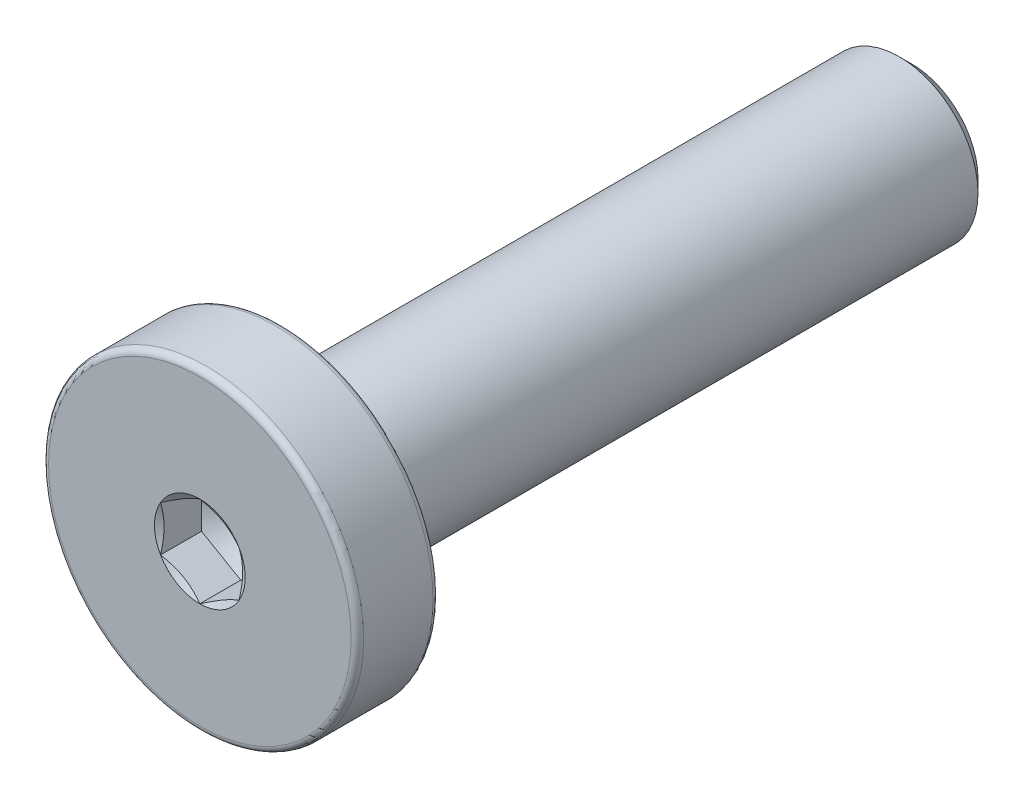
ISO-10303-21;
HEADER;
FILE_DESCRIPTION(('STEP AP214'),'2;1');
FILE_NAME('part.step','',(''),(''),'','','');
FILE_SCHEMA(('AUTOMOTIVE_DESIGN { 1 0 10303 214 1 1 1 1 }'));
ENDSEC;
DATA;
#1=APPLICATION_CONTEXT('core data for automotive mechanical design processes');
#2=APPLICATION_PROTOCOL_DEFINITION('international standard','automotive_design',2000,#1);
#3=PRODUCT_CONTEXT('',#1,'mechanical');
#4=PRODUCT('Part','Part','',(#3));
#5=PRODUCT_RELATED_PRODUCT_CATEGORY('part','',(#4));
#6=PRODUCT_DEFINITION_FORMATION('','',#4);
#7=PRODUCT_DEFINITION_CONTEXT('part definition',#1,'design');
#8=PRODUCT_DEFINITION('design','',#6,#7);
#9=PRODUCT_DEFINITION_SHAPE('','',#8);
#10=(LENGTH_UNIT() NAMED_UNIT(*) SI_UNIT(.MILLI.,.METRE.));
#11=(NAMED_UNIT(*) PLANE_ANGLE_UNIT() SI_UNIT($,.RADIAN.));
#12=(NAMED_UNIT(*) SI_UNIT($,.STERADIAN.) SOLID_ANGLE_UNIT());
#13=UNCERTAINTY_MEASURE_WITH_UNIT(LENGTH_MEASURE(1.E-05),#10,'distance_accuracy_value','');
#14=(GEOMETRIC_REPRESENTATION_CONTEXT(3) GLOBAL_UNCERTAINTY_ASSIGNED_CONTEXT((#13)) GLOBAL_UNIT_ASSIGNED_CONTEXT((#10,
#11,#12)) REPRESENTATION_CONTEXT('',''));
#15=CARTESIAN_POINT('',(0.,0.,0.));
#16=DIRECTION('',(0.,0.,1.));
#17=DIRECTION('',(1.,0.,0.));
#18=AXIS2_PLACEMENT_3D('',#15,#16,#17);
#19=CARTESIAN_POINT('',(0.,0.,1.3));
#20=DIRECTION('',(0.,0.,-1.));
#21=DIRECTION('',(-1.,0.,0.));
#22=AXIS2_PLACEMENT_3D('',#19,#20,#21);
#23=PLANE('',#22);
#24=CARTESIAN_POINT('',(0.,0.,1.3));
#25=DIRECTION('',(0.,0.,-1.));
#26=DIRECTION('',(-1.,0.,0.));
#27=AXIS2_PLACEMENT_3D('',#24,#25,#26);
#28=CIRCLE('',#27,2.4);
#29=CARTESIAN_POINT('',(-2.4,0.,1.3));
#30=VERTEX_POINT('',#29);
#31=EDGE_CURVE('E221',#30,#30,#28,.F.);
#32=ORIENTED_EDGE('',*,*,#31,.T.);
#33=EDGE_LOOP('',(#32));
#34=FACE_BOUND('',#33,.T.);
#35=CARTESIAN_POINT('',(0.,0.,1.3));
#36=DIRECTION('',(0.,0.,1.));
#37=DIRECTION('',(1.,0.,0.));
#38=AXIS2_PLACEMENT_3D('',#35,#36,#37);
#39=CIRCLE('',#38,0.72);
#40=CARTESIAN_POINT('',(-0.623538290724796,-0.36,1.3));
#41=VERTEX_POINT('',#40);
#42=CARTESIAN_POINT('',(0.,-0.72,1.3));
#43=VERTEX_POINT('',#42);
#44=EDGE_CURVE('E133',#41,#43,#39,.T.);
#45=ORIENTED_EDGE('',*,*,#44,.F.);
#46=CARTESIAN_POINT('',(-0.623538290724796,0.36,1.3));
#47=VERTEX_POINT('',#46);
#48=EDGE_CURVE('E132',#47,#41,#39,.T.);
#49=ORIENTED_EDGE('',*,*,#48,.F.);
#50=CARTESIAN_POINT('',(0.,0.72,1.3));
#51=VERTEX_POINT('',#50);
#52=EDGE_CURVE('E103',#51,#47,#39,.T.);
#53=ORIENTED_EDGE('',*,*,#52,.F.);
#54=CARTESIAN_POINT('',(0.623538290724796,0.36,1.3));
#55=VERTEX_POINT('',#54);
#56=EDGE_CURVE('E95',#55,#51,#39,.T.);
#57=ORIENTED_EDGE('',*,*,#56,.F.);
#58=CARTESIAN_POINT('',(0.623538290724796,-0.36,1.3));
#59=VERTEX_POINT('',#58);
#60=EDGE_CURVE('E53',#59,#55,#39,.T.);
#61=ORIENTED_EDGE('',*,*,#60,.F.);
#62=EDGE_CURVE('E60',#43,#59,#39,.T.);
#63=ORIENTED_EDGE('',*,*,#62,.F.);
#64=EDGE_LOOP('',(#45,#49,#53,#57,#61,#63));
#65=FACE_BOUND('',#64,.T.);
#66=ADVANCED_FACE('F34',(#34,#65),#23,.F.);
#67=CARTESIAN_POINT('',(0.,0.,1.3));
#68=DIRECTION('',(0.,0.,1.));
#69=DIRECTION('',(1.,0.,0.));
#70=AXIS2_PLACEMENT_3D('',#67,#68,#69);
#71=CYLINDRICAL_SURFACE('',#70,2.5);
#72=CARTESIAN_POINT('',(0.,0.,0.0999999999999996));
#73=DIRECTION('',(0.,0.,1.));
#74=DIRECTION('',(1.,0.,0.));
#75=AXIS2_PLACEMENT_3D('',#72,#73,#74);
#76=CIRCLE('',#75,2.5);
#77=CARTESIAN_POINT('',(2.5,0.,0.0999999999999996));
#78=VERTEX_POINT('',#77);
#79=EDGE_CURVE('E228',#78,#78,#76,.T.);
#80=ORIENTED_EDGE('',*,*,#79,.T.);
#81=EDGE_LOOP('',(#80));
#82=FACE_BOUND('',#81,.T.);
#83=CARTESIAN_POINT('',(0.,0.,1.2));
#84=DIRECTION('',(0.,0.,-1.));
#85=DIRECTION('',(-1.,0.,0.));
#86=AXIS2_PLACEMENT_3D('',#83,#84,#85);
#87=CIRCLE('',#86,2.5);
#88=CARTESIAN_POINT('',(-2.5,0.,1.2));
#89=VERTEX_POINT('',#88);
#90=EDGE_CURVE('E219',#89,#89,#87,.T.);
#91=ORIENTED_EDGE('',*,*,#90,.T.);
#92=EDGE_LOOP('',(#91));
#93=FACE_BOUND('',#92,.T.);
#94=ADVANCED_FACE('F193',(#82,#93),#71,.T.);
#95=CARTESIAN_POINT('',(0.,2.5,0.));
#96=DIRECTION('',(0.,0.,1.));
#97=DIRECTION('',(1.,0.,0.));
#98=AXIS2_PLACEMENT_3D('',#95,#96,#97);
#99=PLANE('',#98);
#100=CARTESIAN_POINT('',(0.,0.,0.));
#101=DIRECTION('',(0.,0.,1.));
#102=DIRECTION('',(1.,0.,0.));
#103=AXIS2_PLACEMENT_3D('',#100,#101,#102);
#104=CIRCLE('',#103,2.4);
#105=CARTESIAN_POINT('',(2.4,0.,0.));
#106=VERTEX_POINT('',#105);
#107=EDGE_CURVE('E223',#106,#106,#104,.F.);
#108=ORIENTED_EDGE('',*,*,#107,.T.);
#109=EDGE_LOOP('',(#108));
#110=FACE_BOUND('',#109,.T.);
#111=CARTESIAN_POINT('',(0.,0.,0.));
#112=DIRECTION('',(0.,0.,1.));
#113=DIRECTION('',(1.,0.,0.));
#114=AXIS2_PLACEMENT_3D('',#111,#112,#113);
#115=CIRCLE('',#114,1.25);
#116=CARTESIAN_POINT('',(1.25,0.,0.));
#117=VERTEX_POINT('',#116);
#118=EDGE_CURVE('E243',#117,#117,#115,.T.);
#119=ORIENTED_EDGE('',*,*,#118,.T.);
#120=EDGE_LOOP('',(#119));
#121=FACE_BOUND('',#120,.T.);
#122=ADVANCED_FACE('F199',(#110,#121),#99,.F.);
#123=CARTESIAN_POINT('',(0.,0.,1.3));
#124=DIRECTION('',(0.,0.,1.));
#125=DIRECTION('',(1.,0.,0.));
#126=AXIS2_PLACEMENT_3D('',#123,#124,#125);
#127=CYLINDRICAL_SURFACE('',#126,1.25);
#128=CARTESIAN_POINT('',(0.,0.,-9.8));
#129=DIRECTION('',(0.,0.,1.));
#130=DIRECTION('',(1.,0.,0.));
#131=AXIS2_PLACEMENT_3D('',#128,#129,#130);
#132=CIRCLE('',#131,1.25);
#133=CARTESIAN_POINT('',(1.25,0.,-9.8));
#134=VERTEX_POINT('',#133);
#135=EDGE_CURVE('E222',#134,#134,#132,.T.);
#136=ORIENTED_EDGE('',*,*,#135,.T.);
#137=EDGE_LOOP('',(#136));
#138=FACE_BOUND('',#137,.T.);
#139=ORIENTED_EDGE('',*,*,#118,.F.);
#140=EDGE_LOOP('',(#139));
#141=FACE_BOUND('',#140,.T.);
#142=ADVANCED_FACE('F237',(#138,#141),#127,.T.);
#143=CARTESIAN_POINT('',(0.,1.25,-10.));
#144=DIRECTION('',(0.,0.,1.));
#145=DIRECTION('',(1.,0.,0.));
#146=AXIS2_PLACEMENT_3D('',#143,#144,#145);
#147=PLANE('',#146);
#148=CARTESIAN_POINT('',(0.,0.,-10.));
#149=DIRECTION('',(0.,0.,1.));
#150=DIRECTION('',(1.,0.,0.));
#151=AXIS2_PLACEMENT_3D('',#148,#149,#150);
#152=CIRCLE('',#151,1.05);
#153=CARTESIAN_POINT('',(1.05,0.,-10.));
#154=VERTEX_POINT('',#153);
#155=EDGE_CURVE('E47',#154,#154,#152,.F.);
#156=ORIENTED_EDGE('',*,*,#155,.T.);
#157=EDGE_LOOP('',(#156));
#158=FACE_BOUND('',#157,.T.);
#159=ADVANCED_FACE('F208',(#158),#147,.F.);
#160=CARTESIAN_POINT('',(0.,0.,0.0999999999999996));
#161=DIRECTION('',(0.,0.,1.));
#162=DIRECTION('',(1.,0.,0.));
#163=AXIS2_PLACEMENT_3D('',#160,#161,#162);
#164=TOROIDAL_SURFACE('',#163,2.4,0.1);
#165=ORIENTED_EDGE('',*,*,#107,.F.);
#166=EDGE_LOOP('',(#165));
#167=FACE_BOUND('',#166,.T.);
#168=ORIENTED_EDGE('',*,*,#79,.F.);
#169=EDGE_LOOP('',(#168));
#170=FACE_BOUND('',#169,.T.);
#171=ADVANCED_FACE('F205',(#167,#170),#164,.T.);
#172=CARTESIAN_POINT('',(0.,0.,1.2));
#173=DIRECTION('',(0.,0.,-1.));
#174=DIRECTION('',(-1.,0.,0.));
#175=AXIS2_PLACEMENT_3D('',#172,#173,#174);
#176=TOROIDAL_SURFACE('',#175,2.4,0.1);
#177=ORIENTED_EDGE('',*,*,#90,.F.);
#178=EDGE_LOOP('',(#177));
#179=FACE_BOUND('',#178,.T.);
#180=ORIENTED_EDGE('',*,*,#31,.F.);
#181=EDGE_LOOP('',(#180));
#182=FACE_BOUND('',#181,.T.);
#183=ADVANCED_FACE('F207',(#179,#182),#176,.T.);
#184=CARTESIAN_POINT('',(0.,0.,-9.8));
#185=DIRECTION('',(0.,0.,1.));
#186=DIRECTION('',(1.,0.,0.));
#187=AXIS2_PLACEMENT_3D('',#184,#185,#186);
#188=CONICAL_SURFACE('',#187,1.25,0.785398163397446);
#189=ORIENTED_EDGE('',*,*,#155,.F.);
#190=EDGE_LOOP('',(#189));
#191=FACE_BOUND('',#190,.T.);
#192=ORIENTED_EDGE('',*,*,#135,.F.);
#193=EDGE_LOOP('',(#192));
#194=FACE_BOUND('',#193,.T.);
#195=ADVANCED_FACE('F36',(#191,#194),#188,.T.);
#196=CARTESIAN_POINT('',(0.,0.,1.21339745962156));
#197=DIRECTION('',(0.,0.,1.));
#198=DIRECTION('',(1.,0.,0.));
#199=AXIS2_PLACEMENT_3D('',#196,#197,#198);
#200=CONICAL_SURFACE('',#199,0.57,1.04719755119659);
#201=CARTESIAN_POINT('',(-0.623738290724796,0.359884529946162,1.3000666827016));
#202=CARTESIAN_POINT('',(-0.596334183076224,0.375706298873966,1.29092498161154));
#203=CARTESIAN_POINT('',(-0.568693531334009,0.391664636597911,1.28261024715404));
#204=CARTESIAN_POINT('',(-0.512933373317775,0.42385777883864,1.2680952088981));
#205=CARTESIAN_POINT('',(-0.484812874577336,0.440093156356179,1.26190004273057));
#206=CARTESIAN_POINT('',(-0.428920461083287,0.472362656332626,1.25225419383433));
#207=CARTESIAN_POINT('',(-0.401157157448591,0.488391807159711,1.24873934968173));
#208=CARTESIAN_POINT('',(-0.345499589350676,0.520525719083482,1.24453960193827));
#209=CARTESIAN_POINT('',(-0.317605527850044,0.536630362999664,1.24385122457042));
#210=CARTESIAN_POINT('',(-0.265452978487134,0.566740651413265,1.24526616577312));
#211=CARTESIAN_POINT('',(-0.241186794877551,0.580750739052463,1.24702294779668));
#212=CARTESIAN_POINT('',(-0.192830842697051,0.608669061060795,1.25259443621591));
#213=CARTESIAN_POINT('',(-0.168741106372919,0.62257727681224,1.25640950971197));
#214=CARTESIAN_POINT('',(-0.120293921029821,0.650548272311557,1.26594997998605));
#215=CARTESIAN_POINT('',(-0.0959427227560178,0.664607443190027,1.27171659508746));
#216=CARTESIAN_POINT('',(-0.0476039961030963,0.692515820035375,1.2848053589815));
#217=CARTESIAN_POINT('',(-0.023615846060041,0.706365384920094,1.29212442253269));
#218=CARTESIAN_POINT('',(0.00019999999999998,0.720115470053838,1.3000666827016));
#219=B_SPLINE_CURVE_WITH_KNOTS('',3,(#201,#202,#203,#204,#205,#206,#207,#208,#209,#210,#211,
#212,#213,#214,#215,#216,#217,#218),.UNSPECIFIED.,.F.,.F.,(4,2,2,2,2,2,2,2,4),(0.,
0.0988516266112519,0.197941190173062,0.294577051935842,0.39109411092297,0.475239352026824,
0.559399605565862,0.645461571107035,0.731354078529662),.UNSPECIFIED.);
#220=EDGE_CURVE('E11',#47,#51,#219,.T.);
#221=ORIENTED_EDGE('',*,*,#220,.T.);
#222=ORIENTED_EDGE('',*,*,#52,.T.);
#223=EDGE_LOOP('',(#221,#222));
#224=FACE_BOUND('',#223,.T.);
#225=ADVANCED_FACE('F108',(#224),#200,.F.);
#226=CARTESIAN_POINT('',(-0.623538290724796,-0.950492420756838,1.54061968375292));
#227=CARTESIAN_POINT('',(-0.623538290724796,-0.923148387773106,1.52742187170593));
#228=CARTESIAN_POINT('',(-0.623538290724796,-0.895739561138237,1.51435898036849));
#229=CARTESIAN_POINT('',(-0.623538290724796,-0.840756393091022,1.48857401397823));
#230=CARTESIAN_POINT('',(-0.623538290724796,-0.813182023556048,1.47585199896154));
#231=CARTESIAN_POINT('',(-0.623538290724796,-0.729853886737799,1.43816719951309));
#232=CARTESIAN_POINT('',(-0.623538290724796,-0.673807865396585,1.4138386819791));
#233=CARTESIAN_POINT('',(-0.623538290724796,-0.559963033674609,1.36759316950609));
#234=CARTESIAN_POINT('',(-0.623538290724796,-0.502151470945634,1.34570717177888));
#235=CARTESIAN_POINT('',(-0.623538290724796,-0.38505976560965,1.30652670924574));
#236=CARTESIAN_POINT('',(-0.623538290724796,-0.325783647625673,1.289220923179));
#237=CARTESIAN_POINT('',(-0.623538290724796,-0.235580717587191,1.26881529273624));
#238=CARTESIAN_POINT('',(-0.623538290724796,-0.205289909225538,1.26293808564223));
#239=CARTESIAN_POINT('',(-0.623538290724796,-0.144346972260456,1.2534399552596));
#240=CARTESIAN_POINT('',(-0.623538290724796,-0.11369484252445,1.24981903904531));
#241=CARTESIAN_POINT('',(-0.623538290724796,-0.0523810271352916,1.24515303668703));
#242=CARTESIAN_POINT('',(-0.623538290724796,-0.021720583070136,1.2440920931476));
#243=CARTESIAN_POINT('',(-0.623538290724796,0.0395686086964655,1.24459725450364));
#244=CARTESIAN_POINT('',(-0.623538290724796,0.0701973624271658,1.24616269925383));
#245=CARTESIAN_POINT('',(-0.623538290724796,0.144569177597164,1.25301299302503));
#246=CARTESIAN_POINT('',(-0.623538290724796,0.188190488736798,1.25962488285429));
#247=CARTESIAN_POINT('',(-0.623538290724796,0.274613833285284,1.27697245837768));
#248=CARTESIAN_POINT('',(-0.623538290724796,0.317414828320168,1.28771304941856));
#249=CARTESIAN_POINT('',(-0.623538290724796,0.403152432871886,1.31245058367352));
#250=CARTESIAN_POINT('',(-0.623538290724796,0.44606785593737,1.32651918881287));
#251=CARTESIAN_POINT('',(-0.623538290724796,0.509725385364103,1.34918952587781));
#252=CARTESIAN_POINT('',(-0.623538290724796,0.530763905493329,1.356982117505));
#253=CARTESIAN_POINT('',(-0.623538290724796,0.572678497049816,1.37301880372217));
#254=CARTESIAN_POINT('',(-0.623538290724796,0.59355449741943,1.38126308438853));
#255=CARTESIAN_POINT('',(-0.623538290724796,0.614356560025995,1.38969016402321));
#256=B_SPLINE_CURVE_WITH_KNOTS('',3,(#226,#227,#228,#229,#230,#231,#232,#233,#234,#235,#236,
#237,#238,#239,#240,#241,#242,#243,#244,#245,#246,#247,#248,#249,#250,#251,#252,#253,#254,#255),
.UNSPECIFIED.,.F.,.F.,(4,2,2,2,2,2,2,2,2,2,2,2,2,2,4),(0.,0.0910858749532263,0.182187688145635,
0.365435618950376,0.550793815170379,0.735689475406527,0.828187388463122,0.920685591534937,
1.01260933953622,1.10450998587462,1.23659516172562,1.36883775663413,1.5042395149033,
1.57154208016627,1.63887258275582),.UNSPECIFIED.);
#257=EDGE_CURVE('E102',#41,#47,#256,.T.);
#258=ORIENTED_EDGE('',*,*,#257,.T.);
#259=ORIENTED_EDGE('',*,*,#48,.T.);
#260=EDGE_LOOP('',(#258,#259));
#261=FACE_BOUND('',#260,.T.);
#262=ADVANCED_FACE('F378',(#261),#200,.F.);
#263=CARTESIAN_POINT('',(0.000200000000000004,-0.720115470053838,1.3000666827016));
#264=CARTESIAN_POINT('',(-0.0272041076485716,-0.704293701126034,1.29092498161154));
#265=CARTESIAN_POINT('',(-0.0548447593907865,-0.688335363402089,1.28261024715404));
#266=CARTESIAN_POINT('',(-0.11060491740702,-0.65614222116136,1.2680952088981));
#267=CARTESIAN_POINT('',(-0.13872541614746,-0.639906843643821,1.26190004273057));
#268=CARTESIAN_POINT('',(-0.194617829641508,-0.607637343667374,1.25225419383433));
#269=CARTESIAN_POINT('',(-0.222381133276205,-0.591608192840289,1.24873934968173));
#270=CARTESIAN_POINT('',(-0.27803870137412,-0.559474280916518,1.24453960193827));
#271=CARTESIAN_POINT('',(-0.305932762874752,-0.543369637000336,1.24385122457042));
#272=CARTESIAN_POINT('',(-0.358085312237661,-0.513259348586735,1.24526616577312));
#273=CARTESIAN_POINT('',(-0.382351495847245,-0.499249260947537,1.24702294779668));
#274=CARTESIAN_POINT('',(-0.430707448027745,-0.471330938939204,1.25259443621591));
#275=CARTESIAN_POINT('',(-0.454797184351877,-0.45742272318776,1.25640950971197));
#276=CARTESIAN_POINT('',(-0.503244369694975,-0.429451727688443,1.26594997998605));
#277=CARTESIAN_POINT('',(-0.527595567968778,-0.415392556809973,1.27171659508746));
#278=CARTESIAN_POINT('',(-0.575934294621699,-0.387484179964625,1.2848053589815));
#279=CARTESIAN_POINT('',(-0.599922444664755,-0.373634615079905,1.29212442253269));
#280=CARTESIAN_POINT('',(-0.623738290724796,-0.359884529946162,1.3000666827016));
#281=B_SPLINE_CURVE_WITH_KNOTS('',3,(#263,#264,#265,#266,#267,#268,#269,#270,#271,#272,#273,
#274,#275,#276,#277,#278,#279,#280),.UNSPECIFIED.,.F.,.F.,(4,2,2,2,2,2,2,2,4),(0.,
0.0988516266112519,0.197941190173062,0.294577051935842,0.39109411092297,0.475239352026824,
0.559399605565862,0.645461571107035,0.731354078529662),.UNSPECIFIED.);
#282=EDGE_CURVE('E140',#43,#41,#281,.T.);
#283=ORIENTED_EDGE('',*,*,#282,.T.);
#284=ORIENTED_EDGE('',*,*,#44,.T.);
#285=EDGE_LOOP('',(#283,#284));
#286=FACE_BOUND('',#285,.T.);
#287=ADVANCED_FACE('F370',(#286),#200,.F.);
#288=CARTESIAN_POINT('',(0.623738290724796,-0.359884529946162,1.3000666827016));
#289=CARTESIAN_POINT('',(0.596334183076224,-0.375706298873966,1.29092498161154));
#290=CARTESIAN_POINT('',(0.568693531334009,-0.391664636597911,1.28261024715404));
#291=CARTESIAN_POINT('',(0.512933373317775,-0.42385777883864,1.2680952088981));
#292=CARTESIAN_POINT('',(0.484812874577336,-0.440093156356179,1.26190004273057));
#293=CARTESIAN_POINT('',(0.428920461083287,-0.472362656332626,1.25225419383433));
#294=CARTESIAN_POINT('',(0.401157157448591,-0.488391807159711,1.24873934968173));
#295=CARTESIAN_POINT('',(0.345499589350676,-0.520525719083482,1.24453960193827));
#296=CARTESIAN_POINT('',(0.317605527850044,-0.536630362999664,1.24385122457042));
#297=CARTESIAN_POINT('',(0.265452978487134,-0.566740651413265,1.24526616577312));
#298=CARTESIAN_POINT('',(0.241186794877551,-0.580750739052463,1.24702294779668));
#299=CARTESIAN_POINT('',(0.192830842697051,-0.608669061060795,1.25259443621591));
#300=CARTESIAN_POINT('',(0.168741106372919,-0.62257727681224,1.25640950971197));
#301=CARTESIAN_POINT('',(0.120293921029821,-0.650548272311557,1.26594997998605));
#302=CARTESIAN_POINT('',(0.0959427227560178,-0.664607443190027,1.27171659508746));
#303=CARTESIAN_POINT('',(0.0476039961030963,-0.692515820035375,1.2848053589815));
#304=CARTESIAN_POINT('',(0.0236158460600411,-0.706365384920094,1.29212442253269));
#305=CARTESIAN_POINT('',(-0.000199999999999944,-0.720115470053838,1.3000666827016));
#306=B_SPLINE_CURVE_WITH_KNOTS('',3,(#288,#289,#290,#291,#292,#293,#294,#295,#296,#297,#298,
#299,#300,#301,#302,#303,#304,#305),.UNSPECIFIED.,.F.,.F.,(4,2,2,2,2,2,2,2,4),(0.,
0.0988516266112519,0.197941190173062,0.294577051935842,0.39109411092297,0.475239352026824,
0.559399605565862,0.645461571107035,0.731354078529662),.UNSPECIFIED.);
#307=EDGE_CURVE('E159',#59,#43,#306,.T.);
#308=ORIENTED_EDGE('',*,*,#307,.T.);
#309=ORIENTED_EDGE('',*,*,#62,.T.);
#310=EDGE_LOOP('',(#308,#309));
#311=FACE_BOUND('',#310,.T.);
#312=ADVANCED_FACE('F362',(#311),#200,.F.);
#313=CARTESIAN_POINT('',(0.623538290724796,-0.950492420756839,1.54061968375292));
#314=CARTESIAN_POINT('',(0.623538290724796,-0.923148387773106,1.52742187170593));
#315=CARTESIAN_POINT('',(0.623538290724796,-0.895739561138237,1.51435898036849));
#316=CARTESIAN_POINT('',(0.623538290724796,-0.840756393091022,1.48857401397823));
#317=CARTESIAN_POINT('',(0.623538290724796,-0.813182023556048,1.47585199896154));
#318=CARTESIAN_POINT('',(0.623538290724796,-0.7298538867378,1.43816719951309));
#319=CARTESIAN_POINT('',(0.623538290724796,-0.673807865396585,1.4138386819791));
#320=CARTESIAN_POINT('',(0.623538290724796,-0.559963033674609,1.36759316950609));
#321=CARTESIAN_POINT('',(0.623538290724796,-0.502151470945634,1.34570717177888));
#322=CARTESIAN_POINT('',(0.623538290724796,-0.38505976560965,1.30652670924574));
#323=CARTESIAN_POINT('',(0.623538290724796,-0.325783647625673,1.289220923179));
#324=CARTESIAN_POINT('',(0.623538290724796,-0.235580717587191,1.26881529273624));
#325=CARTESIAN_POINT('',(0.623538290724796,-0.205289909225538,1.26293808564223));
#326=CARTESIAN_POINT('',(0.623538290724796,-0.144346972260456,1.2534399552596));
#327=CARTESIAN_POINT('',(0.623538290724796,-0.11369484252445,1.24981903904531));
#328=CARTESIAN_POINT('',(0.623538290724796,-0.0523810271352916,1.24515303668703));
#329=CARTESIAN_POINT('',(0.623538290724796,-0.021720583070136,1.2440920931476));
#330=CARTESIAN_POINT('',(0.623538290724796,0.0395686086964655,1.24459725450364));
#331=CARTESIAN_POINT('',(0.623538290724796,0.0701973624271657,1.24616269925383));
#332=CARTESIAN_POINT('',(0.623538290724796,0.144569177597164,1.25301299302503));
#333=CARTESIAN_POINT('',(0.623538290724796,0.188190488736798,1.25962488285429));
#334=CARTESIAN_POINT('',(0.623538290724796,0.274613833285284,1.27697245837768));
#335=CARTESIAN_POINT('',(0.623538290724796,0.317414828320168,1.28771304941856));
#336=CARTESIAN_POINT('',(0.623538290724796,0.403152432871886,1.31245058367352));
#337=CARTESIAN_POINT('',(0.623538290724796,0.44606785593737,1.32651918881287));
#338=CARTESIAN_POINT('',(0.623538290724796,0.509725385364103,1.34918952587781));
#339=CARTESIAN_POINT('',(0.623538290724796,0.530763905493329,1.356982117505));
#340=CARTESIAN_POINT('',(0.623538290724796,0.572678497049816,1.37301880372217));
#341=CARTESIAN_POINT('',(0.623538290724796,0.59355449741943,1.38126308438853));
#342=CARTESIAN_POINT('',(0.623538290724796,0.614356560025995,1.38969016402321));
#343=B_SPLINE_CURVE_WITH_KNOTS('',3,(#313,#314,#315,#316,#317,#318,#319,#320,#321,#322,#323,
#324,#325,#326,#327,#328,#329,#330,#331,#332,#333,#334,#335,#336,#337,#338,#339,#340,#341,#342),
.UNSPECIFIED.,.F.,.F.,(4,2,2,2,2,2,2,2,2,2,2,2,2,2,4),(0.,0.0910858749532264,0.182187688145635,
0.365435618950376,0.55079381517038,0.735689475406527,0.828187388463122,0.920685591534938,
1.01260933953622,1.10450998587462,1.23659516172562,1.36883775663413,1.5042395149033,
1.57154208016627,1.63887258275582),.UNSPECIFIED.);
#344=EDGE_CURVE('E123',#55,#59,#343,.F.);
#345=ORIENTED_EDGE('',*,*,#344,.T.);
#346=ORIENTED_EDGE('',*,*,#60,.T.);
#347=EDGE_LOOP('',(#345,#346));
#348=FACE_BOUND('',#347,.T.);
#349=ADVANCED_FACE('F152',(#348),#200,.F.);
#350=CARTESIAN_POINT('',(-0.000199999999999996,0.720115470053838,1.3000666827016));
#351=CARTESIAN_POINT('',(0.0272041076485716,0.704293701126034,1.29092498161154));
#352=CARTESIAN_POINT('',(0.0548447593907865,0.688335363402089,1.28261024715404));
#353=CARTESIAN_POINT('',(0.11060491740702,0.65614222116136,1.2680952088981));
#354=CARTESIAN_POINT('',(0.13872541614746,0.639906843643821,1.26190004273057));
#355=CARTESIAN_POINT('',(0.194617829641508,0.607637343667374,1.25225419383433));
#356=CARTESIAN_POINT('',(0.222381133276205,0.591608192840289,1.24873934968173));
#357=CARTESIAN_POINT('',(0.27803870137412,0.559474280916518,1.24453960193827));
#358=CARTESIAN_POINT('',(0.305932762874752,0.543369637000336,1.24385122457042));
#359=CARTESIAN_POINT('',(0.358085312237661,0.513259348586735,1.24526616577312));
#360=CARTESIAN_POINT('',(0.382351495847245,0.499249260947537,1.24702294779668));
#361=CARTESIAN_POINT('',(0.430707448027745,0.471330938939204,1.25259443621591));
#362=CARTESIAN_POINT('',(0.454797184351877,0.45742272318776,1.25640950971197));
#363=CARTESIAN_POINT('',(0.503244369694975,0.429451727688443,1.26594997998605));
#364=CARTESIAN_POINT('',(0.527595567968778,0.415392556809973,1.27171659508746));
#365=CARTESIAN_POINT('',(0.575934294621699,0.387484179964625,1.2848053589815));
#366=CARTESIAN_POINT('',(0.599922444664755,0.373634615079905,1.29212442253269));
#367=CARTESIAN_POINT('',(0.623738290724796,0.359884529946162,1.3000666827016));
#368=B_SPLINE_CURVE_WITH_KNOTS('',3,(#350,#351,#352,#353,#354,#355,#356,#357,#358,#359,#360,
#361,#362,#363,#364,#365,#366,#367),.UNSPECIFIED.,.F.,.F.,(4,2,2,2,2,2,2,2,4),(0.,
0.0988516266112519,0.197941190173062,0.294577051935842,0.39109411092297,0.475239352026824,
0.559399605565862,0.645461571107035,0.731354078529662),.UNSPECIFIED.);
#369=EDGE_CURVE('E98',#51,#55,#368,.T.);
#370=ORIENTED_EDGE('',*,*,#369,.T.);
#371=ORIENTED_EDGE('',*,*,#56,.T.);
#372=EDGE_LOOP('',(#370,#371));
#373=FACE_BOUND('',#372,.T.);
#374=ADVANCED_FACE('F96',(#373),#200,.F.);
#375=CARTESIAN_POINT('',(0.,0.,0.217380354300159));
#376=DIRECTION('',(0.,0.,1.));
#377=DIRECTION('',(1.,0.,0.));
#378=AXIS2_PLACEMENT_3D('',#375,#376,#377);
#379=CONICAL_SURFACE('',#378,0.,1.02974425867666);
#380=CARTESIAN_POINT('',(0.,0.,0.65));
#381=DIRECTION('',(0.,0.,1.));
#382=DIRECTION('',(1.,0.,0.));
#383=AXIS2_PLACEMENT_3D('',#380,#381,#382);
#384=CIRCLE('',#383,0.72);
#385=CARTESIAN_POINT('',(0.623538290724796,0.36,0.65));
#386=VERTEX_POINT('',#385);
#387=CARTESIAN_POINT('',(0.,0.72,0.65));
#388=VERTEX_POINT('',#387);
#389=EDGE_CURVE('E273',#386,#388,#384,.T.);
#390=ORIENTED_EDGE('',*,*,#389,.T.);
#391=CARTESIAN_POINT('',(-0.623538290724796,0.36,0.65));
#392=VERTEX_POINT('',#391);
#393=EDGE_CURVE('E275',#388,#392,#384,.T.);
#394=ORIENTED_EDGE('',*,*,#393,.T.);
#395=CARTESIAN_POINT('',(-0.623538290724796,-0.36,0.65));
#396=VERTEX_POINT('',#395);
#397=EDGE_CURVE('E280',#392,#396,#384,.T.);
#398=ORIENTED_EDGE('',*,*,#397,.T.);
#399=CARTESIAN_POINT('',(0.,-0.72,0.65));
#400=VERTEX_POINT('',#399);
#401=EDGE_CURVE('E283',#396,#400,#384,.T.);
#402=ORIENTED_EDGE('',*,*,#401,.T.);
#403=CARTESIAN_POINT('',(0.623538290724796,-0.36,0.65));
#404=VERTEX_POINT('',#403);
#405=EDGE_CURVE('E281',#400,#404,#384,.T.);
#406=ORIENTED_EDGE('',*,*,#405,.T.);
#407=EDGE_CURVE('E122',#404,#386,#384,.T.);
#408=ORIENTED_EDGE('',*,*,#407,.T.);
#409=EDGE_LOOP('',(#390,#394,#398,#402,#406,#408));
#410=FACE_BOUND('',#409,.T.);
#411=CARTESIAN_POINT('',(0.,0.,0.217380354300159));
#412=VERTEX_POINT('',#411);
#413=VERTEX_LOOP('',#412);
#414=FACE_BOUND('',#413,.T.);
#415=ADVANCED_FACE('F151',(#410,#414),#379,.F.);
#416=CARTESIAN_POINT('',(0.,0.,0.65));
#417=DIRECTION('',(0.,0.,-1.));
#418=DIRECTION('',(-1.,0.,0.));
#419=AXIS2_PLACEMENT_3D('',#416,#417,#418);
#420=PLANE('',#419);
#421=DIRECTION('',(-0.866025403784439,0.5,0.));
#422=VECTOR('',#421,1.);
#423=CARTESIAN_POINT('',(0.623538290724796,0.36,0.65));
#424=LINE('',#423,#422);
#425=EDGE_CURVE('E272',#386,#388,#424,.T.);
#426=ORIENTED_EDGE('',*,*,#425,.T.);
#427=ORIENTED_EDGE('',*,*,#389,.F.);
#428=EDGE_LOOP('',(#426,#427));
#429=FACE_BOUND('',#428,.T.);
#430=ADVANCED_FACE('F179',(#429),#420,.T.);
#431=DIRECTION('',(0.,1.,0.));
#432=VECTOR('',#431,1.);
#433=CARTESIAN_POINT('',(0.623538290724796,-0.36,0.65));
#434=LINE('',#433,#432);
#435=EDGE_CURVE('E128',#404,#386,#434,.T.);
#436=ORIENTED_EDGE('',*,*,#435,.T.);
#437=ORIENTED_EDGE('',*,*,#407,.F.);
#438=EDGE_LOOP('',(#436,#437));
#439=FACE_BOUND('',#438,.T.);
#440=ADVANCED_FACE('F306',(#439),#420,.T.);
#441=DIRECTION('',(0.866025403784439,0.5,0.));
#442=VECTOR('',#441,1.);
#443=CARTESIAN_POINT('',(0.,-0.72,0.65));
#444=LINE('',#443,#442);
#445=EDGE_CURVE('E264',#400,#404,#444,.T.);
#446=ORIENTED_EDGE('',*,*,#445,.T.);
#447=ORIENTED_EDGE('',*,*,#405,.F.);
#448=EDGE_LOOP('',(#446,#447));
#449=FACE_BOUND('',#448,.T.);
#450=ADVANCED_FACE('F301',(#449),#420,.T.);
#451=DIRECTION('',(0.866025403784439,-0.5,0.));
#452=VECTOR('',#451,1.);
#453=CARTESIAN_POINT('',(-0.623538290724796,-0.36,0.65));
#454=LINE('',#453,#452);
#455=EDGE_CURVE('E267',#396,#400,#454,.T.);
#456=ORIENTED_EDGE('',*,*,#455,.T.);
#457=ORIENTED_EDGE('',*,*,#401,.F.);
#458=EDGE_LOOP('',(#456,#457));
#459=FACE_BOUND('',#458,.T.);
#460=ADVANCED_FACE('F299',(#459),#420,.T.);
#461=DIRECTION('',(0.,-1.,0.));
#462=VECTOR('',#461,1.);
#463=CARTESIAN_POINT('',(-0.623538290724796,0.36,0.65));
#464=LINE('',#463,#462);
#465=EDGE_CURVE('E269',#392,#396,#464,.T.);
#466=ORIENTED_EDGE('',*,*,#465,.T.);
#467=ORIENTED_EDGE('',*,*,#397,.F.);
#468=EDGE_LOOP('',(#466,#467));
#469=FACE_BOUND('',#468,.T.);
#470=ADVANCED_FACE('F318',(#469),#420,.T.);
#471=DIRECTION('',(-0.866025403784439,-0.5,0.));
#472=VECTOR('',#471,1.);
#473=CARTESIAN_POINT('',(0.,0.72,0.65));
#474=LINE('',#473,#472);
#475=EDGE_CURVE('E126',#388,#392,#474,.T.);
#476=ORIENTED_EDGE('',*,*,#475,.T.);
#477=ORIENTED_EDGE('',*,*,#393,.F.);
#478=EDGE_LOOP('',(#476,#477));
#479=FACE_BOUND('',#478,.T.);
#480=ADVANCED_FACE('F313',(#479),#420,.T.);
#481=CARTESIAN_POINT('',(0.,0.72,0.65));
#482=DIRECTION('',(-0.5,0.866025403784439,0.));
#483=DIRECTION('',(-0.866025403784439,-0.5,0.));
#484=AXIS2_PLACEMENT_3D('',#481,#482,#483);
#485=PLANE('',#484);
#486=ORIENTED_EDGE('',*,*,#220,.F.);
#487=DIRECTION('',(0.,0.,1.));
#488=VECTOR('',#487,1.);
#489=CARTESIAN_POINT('',(-0.623538290724796,0.36,0.65));
#490=LINE('',#489,#488);
#491=EDGE_CURVE('E127',#392,#47,#490,.T.);
#492=ORIENTED_EDGE('',*,*,#491,.F.);
#493=ORIENTED_EDGE('',*,*,#475,.F.);
#494=DIRECTION('',(0.,0.,1.));
#495=VECTOR('',#494,1.);
#496=CARTESIAN_POINT('',(0.,0.72,0.65));
#497=LINE('',#496,#495);
#498=EDGE_CURVE('E118',#388,#51,#497,.T.);
#499=ORIENTED_EDGE('',*,*,#498,.T.);
#500=EDGE_LOOP('',(#486,#492,#493,#499));
#501=FACE_BOUND('',#500,.T.);
#502=ADVANCED_FACE('F125',(#501),#485,.F.);
#503=CARTESIAN_POINT('',(-0.623538290724796,0.36,0.65));
#504=DIRECTION('',(-1.,0.,0.));
#505=DIRECTION('',(0.,0.,1.));
#506=AXIS2_PLACEMENT_3D('',#503,#504,#505);
#507=PLANE('',#506);
#508=ORIENTED_EDGE('',*,*,#257,.F.);
#509=DIRECTION('',(0.,0.,1.));
#510=VECTOR('',#509,1.);
#511=CARTESIAN_POINT('',(-0.623538290724796,-0.36,0.65));
#512=LINE('',#511,#510);
#513=EDGE_CURVE('E255',#396,#41,#512,.T.);
#514=ORIENTED_EDGE('',*,*,#513,.F.);
#515=ORIENTED_EDGE('',*,*,#465,.F.);
#516=ORIENTED_EDGE('',*,*,#491,.T.);
#517=EDGE_LOOP('',(#508,#514,#515,#516));
#518=FACE_BOUND('',#517,.T.);
#519=ADVANCED_FACE('F146',(#518),#507,.F.);
#520=CARTESIAN_POINT('',(-0.623538290724796,-0.36,0.65));
#521=DIRECTION('',(-0.5,-0.866025403784439,0.));
#522=DIRECTION('',(0.866025403784439,-0.5,0.));
#523=AXIS2_PLACEMENT_3D('',#520,#521,#522);
#524=PLANE('',#523);
#525=ORIENTED_EDGE('',*,*,#282,.F.);
#526=DIRECTION('',(0.,0.,1.));
#527=VECTOR('',#526,1.);
#528=CARTESIAN_POINT('',(0.,-0.72,0.65));
#529=LINE('',#528,#527);
#530=EDGE_CURVE('E258',#400,#43,#529,.T.);
#531=ORIENTED_EDGE('',*,*,#530,.F.);
#532=ORIENTED_EDGE('',*,*,#455,.F.);
#533=ORIENTED_EDGE('',*,*,#513,.T.);
#534=EDGE_LOOP('',(#525,#531,#532,#533));
#535=FACE_BOUND('',#534,.T.);
#536=ADVANCED_FACE('F182',(#535),#524,.F.);
#537=CARTESIAN_POINT('',(0.,-0.72,0.65));
#538=DIRECTION('',(0.5,-0.866025403784439,0.));
#539=DIRECTION('',(0.866025403784439,0.5,0.));
#540=AXIS2_PLACEMENT_3D('',#537,#538,#539);
#541=PLANE('',#540);
#542=ORIENTED_EDGE('',*,*,#307,.F.);
#543=DIRECTION('',(0.,0.,1.));
#544=VECTOR('',#543,1.);
#545=CARTESIAN_POINT('',(0.623538290724796,-0.36,0.65));
#546=LINE('',#545,#544);
#547=EDGE_CURVE('E247',#404,#59,#546,.T.);
#548=ORIENTED_EDGE('',*,*,#547,.F.);
#549=ORIENTED_EDGE('',*,*,#445,.F.);
#550=ORIENTED_EDGE('',*,*,#530,.T.);
#551=EDGE_LOOP('',(#542,#548,#549,#550));
#552=FACE_BOUND('',#551,.T.);
#553=ADVANCED_FACE('F177',(#552),#541,.F.);
#554=CARTESIAN_POINT('',(0.623538290724796,-0.36,0.65));
#555=DIRECTION('',(1.,0.,0.));
#556=DIRECTION('',(0.,0.,-1.));
#557=AXIS2_PLACEMENT_3D('',#554,#555,#556);
#558=PLANE('',#557);
#559=ORIENTED_EDGE('',*,*,#344,.F.);
#560=DIRECTION('',(0.,0.,1.));
#561=VECTOR('',#560,1.);
#562=CARTESIAN_POINT('',(0.623538290724796,0.36,0.65));
#563=LINE('',#562,#561);
#564=EDGE_CURVE('E121',#386,#55,#563,.T.);
#565=ORIENTED_EDGE('',*,*,#564,.F.);
#566=ORIENTED_EDGE('',*,*,#435,.F.);
#567=ORIENTED_EDGE('',*,*,#547,.T.);
#568=EDGE_LOOP('',(#559,#565,#566,#567));
#569=FACE_BOUND('',#568,.T.);
#570=ADVANCED_FACE('F174',(#569),#558,.F.);
#571=CARTESIAN_POINT('',(0.623538290724796,0.36,0.65));
#572=DIRECTION('',(0.5,0.866025403784439,0.));
#573=DIRECTION('',(-0.866025403784439,0.5,0.));
#574=AXIS2_PLACEMENT_3D('',#571,#572,#573);
#575=PLANE('',#574);
#576=ORIENTED_EDGE('',*,*,#369,.F.);
#577=ORIENTED_EDGE('',*,*,#498,.F.);
#578=ORIENTED_EDGE('',*,*,#425,.F.);
#579=ORIENTED_EDGE('',*,*,#564,.T.);
#580=EDGE_LOOP('',(#576,#577,#578,#579));
#581=FACE_BOUND('',#580,.T.);
#582=ADVANCED_FACE('F116',(#581),#575,.F.);
#583=CLOSED_SHELL('',(#66,#94,#122,#142,#159,#171,#183,#195,#225,#262,#287,#312,#349,#374,#415,
#430,#440,#450,#460,#470,#480,#502,#519,#536,#553,#570,#582));
#584=MANIFOLD_SOLID_BREP('B2',#583);
#585=ADVANCED_BREP_SHAPE_REPRESENTATION('',(#18,#584),#14);
#586=SHAPE_DEFINITION_REPRESENTATION(#9,#585);
ENDSEC;
END-ISO-10303-21;
